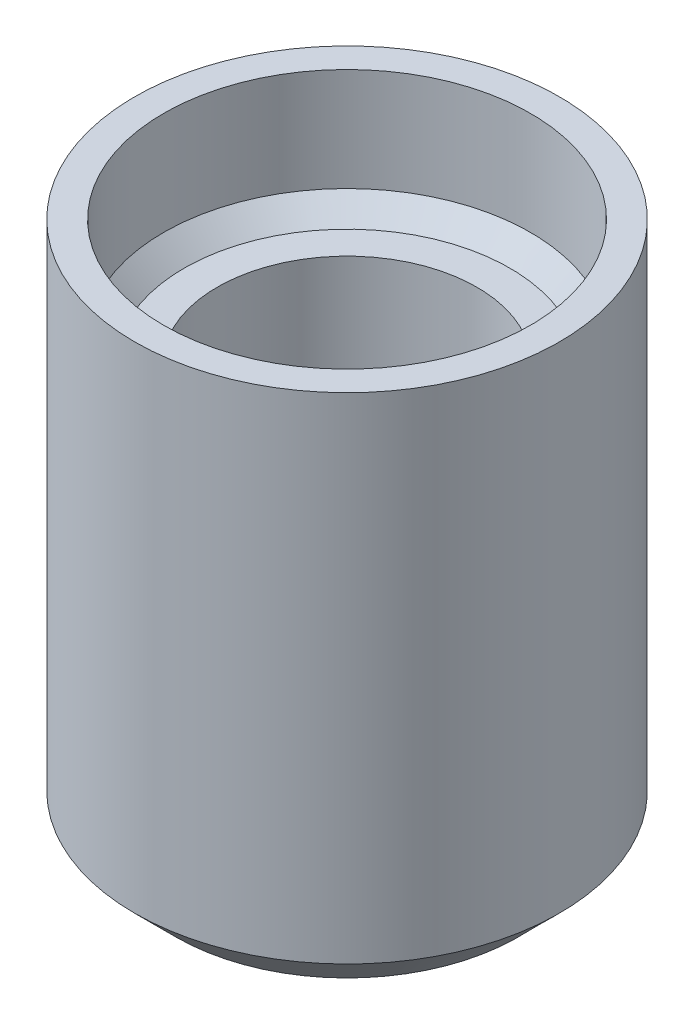
ISO-10303-21;
HEADER;
FILE_DESCRIPTION(('STEP AP214'),'2;1');
FILE_NAME('part.step','',(''),(''),'','','');
FILE_SCHEMA(('AUTOMOTIVE_DESIGN { 1 0 10303 214 1 1 1 1 }'));
ENDSEC;
DATA;
#1=APPLICATION_CONTEXT('core data for automotive mechanical design processes');
#2=APPLICATION_PROTOCOL_DEFINITION('international standard','automotive_design',2000,#1);
#3=PRODUCT_CONTEXT('',#1,'mechanical');
#4=PRODUCT('Part','Part','',(#3));
#5=PRODUCT_RELATED_PRODUCT_CATEGORY('part','',(#4));
#6=PRODUCT_DEFINITION_FORMATION('','',#4);
#7=PRODUCT_DEFINITION_CONTEXT('part definition',#1,'design');
#8=PRODUCT_DEFINITION('design','',#6,#7);
#9=PRODUCT_DEFINITION_SHAPE('','',#8);
#10=(LENGTH_UNIT() NAMED_UNIT(*) SI_UNIT(.MILLI.,.METRE.));
#11=(NAMED_UNIT(*) PLANE_ANGLE_UNIT() SI_UNIT($,.RADIAN.));
#12=(NAMED_UNIT(*) SI_UNIT($,.STERADIAN.) SOLID_ANGLE_UNIT());
#13=UNCERTAINTY_MEASURE_WITH_UNIT(LENGTH_MEASURE(1.E-05),#10,'distance_accuracy_value','');
#14=(GEOMETRIC_REPRESENTATION_CONTEXT(3) GLOBAL_UNCERTAINTY_ASSIGNED_CONTEXT((#13)) GLOBAL_UNIT_ASSIGNED_CONTEXT((#10,
#11,#12)) REPRESENTATION_CONTEXT('',''));
#15=CARTESIAN_POINT('',(0.,0.,0.));
#16=DIRECTION('',(0.,0.,1.));
#17=DIRECTION('',(1.,0.,0.));
#18=AXIS2_PLACEMENT_3D('',#15,#16,#17);
#19=CARTESIAN_POINT('',(0.,10.,0.));
#20=DIRECTION('',(0.,1.,0.));
#21=DIRECTION('',(0.,0.,1.));
#22=AXIS2_PLACEMENT_3D('',#19,#20,#21);
#23=PLANE('',#22);
#24=CARTESIAN_POINT('',(0.,10.,0.));
#25=DIRECTION('',(0.,1.,0.));
#26=DIRECTION('',(0.,0.,1.));
#27=AXIS2_PLACEMENT_3D('',#24,#25,#26);
#28=CIRCLE('',#27,3.95);
#29=CARTESIAN_POINT('',(0.,10.,3.95));
#30=VERTEX_POINT('',#29);
#31=EDGE_CURVE('E11',#30,#30,#28,.T.);
#32=ORIENTED_EDGE('',*,*,#31,.T.);
#33=EDGE_LOOP('',(#32));
#34=FACE_BOUND('',#33,.T.);
#35=CARTESIAN_POINT('',(0.,10.,0.));
#36=DIRECTION('',(0.,1.,0.));
#37=DIRECTION('',(0.,0.,1.));
#38=AXIS2_PLACEMENT_3D('',#35,#36,#37);
#39=CIRCLE('',#38,3.15);
#40=CARTESIAN_POINT('',(2.68328157299975,10.,1.65));
#41=VERTEX_POINT('',#40);
#42=CARTESIAN_POINT('',(-2.68328157299975,10.,1.65));
#43=VERTEX_POINT('',#42);
#44=EDGE_CURVE('E89',#41,#43,#39,.T.);
#45=ORIENTED_EDGE('',*,*,#44,.F.);
#46=DIRECTION('',(1.,0.,0.));
#47=VECTOR('',#46,1.);
#48=CARTESIAN_POINT('',(0.,10.,1.65));
#49=LINE('',#48,#47);
#50=EDGE_CURVE('E93',#43,#41,#49,.T.);
#51=ORIENTED_EDGE('',*,*,#50,.F.);
#52=EDGE_LOOP('',(#45,#51));
#53=FACE_BOUND('',#52,.T.);
#54=ADVANCED_FACE('F49',(#34,#53),#23,.T.);
#55=CARTESIAN_POINT('',(0.,10.,0.));
#56=DIRECTION('',(0.,-1.,0.));
#57=DIRECTION('',(0.,0.,-1.));
#58=AXIS2_PLACEMENT_3D('',#55,#56,#57);
#59=CYLINDRICAL_SURFACE('',#58,3.15);
#60=DIRECTION('',(0.,-1.,0.));
#61=VECTOR('',#60,1.);
#62=CARTESIAN_POINT('',(-2.68328157299975,10.,1.65));
#63=LINE('',#62,#61);
#64=CARTESIAN_POINT('',(-2.68328157299975,2.,1.65));
#65=VERTEX_POINT('',#64);
#66=EDGE_CURVE('E72',#43,#65,#63,.T.);
#67=ORIENTED_EDGE('',*,*,#66,.T.);
#68=CARTESIAN_POINT('',(0.,2.,0.));
#69=DIRECTION('',(0.,-1.,0.));
#70=DIRECTION('',(0.,0.,-1.));
#71=AXIS2_PLACEMENT_3D('',#68,#69,#70);
#72=CIRCLE('',#71,3.15);
#73=CARTESIAN_POINT('',(2.68328157299975,2.,1.65));
#74=VERTEX_POINT('',#73);
#75=EDGE_CURVE('E65',#65,#74,#72,.T.);
#76=ORIENTED_EDGE('',*,*,#75,.T.);
#77=DIRECTION('',(0.,-1.,0.));
#78=VECTOR('',#77,1.);
#79=CARTESIAN_POINT('',(2.68328157299975,10.,1.65));
#80=LINE('',#79,#78);
#81=EDGE_CURVE('E86',#41,#74,#80,.T.);
#82=ORIENTED_EDGE('',*,*,#81,.F.);
#83=ORIENTED_EDGE('',*,*,#44,.T.);
#84=EDGE_LOOP('',(#67,#76,#82,#83));
#85=FACE_BOUND('',#84,.T.);
#86=ADVANCED_FACE('F85',(#85),#59,.F.);
#87=CARTESIAN_POINT('',(0.,10.,1.65));
#88=DIRECTION('',(0.,0.,-1.));
#89=DIRECTION('',(-1.,0.,0.));
#90=AXIS2_PLACEMENT_3D('',#87,#88,#89);
#91=PLANE('',#90);
#92=ORIENTED_EDGE('',*,*,#81,.T.);
#93=DIRECTION('',(-1.,0.,0.));
#94=VECTOR('',#93,1.);
#95=CARTESIAN_POINT('',(0.,2.,1.65));
#96=LINE('',#95,#94);
#97=EDGE_CURVE('E78',#74,#65,#96,.T.);
#98=ORIENTED_EDGE('',*,*,#97,.T.);
#99=ORIENTED_EDGE('',*,*,#66,.F.);
#100=ORIENTED_EDGE('',*,*,#50,.T.);
#101=EDGE_LOOP('',(#92,#98,#99,#100));
#102=FACE_BOUND('',#101,.T.);
#103=ADVANCED_FACE('F91',(#102),#91,.T.);
#104=CARTESIAN_POINT('',(0.,2.,0.));
#105=DIRECTION('',(0.,-1.,0.));
#106=DIRECTION('',(0.,0.,-1.));
#107=AXIS2_PLACEMENT_3D('',#104,#105,#106);
#108=PLANE('',#107);
#109=ORIENTED_EDGE('',*,*,#75,.F.);
#110=ORIENTED_EDGE('',*,*,#97,.F.);
#111=EDGE_LOOP('',(#109,#110));
#112=FACE_BOUND('',#111,.T.);
#113=ADVANCED_FACE('F79',(#112),#108,.F.);
#114=CARTESIAN_POINT('',(0.,13.,0.));
#115=DIRECTION('',(0.,1.,0.));
#116=DIRECTION('',(0.,0.,1.));
#117=AXIS2_PLACEMENT_3D('',#114,#115,#116);
#118=PLANE('',#117);
#119=CARTESIAN_POINT('',(0.,13.,0.));
#120=DIRECTION('',(0.,1.,0.));
#121=DIRECTION('',(0.,0.,1.));
#122=AXIS2_PLACEMENT_3D('',#119,#120,#121);
#123=CIRCLE('',#122,5.15);
#124=CARTESIAN_POINT('',(0.,13.,5.15));
#125=VERTEX_POINT('',#124);
#126=EDGE_CURVE('E82',#125,#125,#123,.T.);
#127=ORIENTED_EDGE('',*,*,#126,.T.);
#128=EDGE_LOOP('',(#127));
#129=FACE_BOUND('',#128,.T.);
#130=CARTESIAN_POINT('',(0.,13.,0.));
#131=DIRECTION('',(0.,1.,0.));
#132=DIRECTION('',(0.,0.,1.));
#133=AXIS2_PLACEMENT_3D('',#130,#131,#132);
#134=CIRCLE('',#133,4.45);
#135=CARTESIAN_POINT('',(0.,13.,4.45));
#136=VERTEX_POINT('',#135);
#137=EDGE_CURVE('E164',#136,#136,#134,.T.);
#138=ORIENTED_EDGE('',*,*,#137,.F.);
#139=EDGE_LOOP('',(#138));
#140=FACE_BOUND('',#139,.T.);
#141=ADVANCED_FACE('F151',(#129,#140),#118,.T.);
#142=CARTESIAN_POINT('',(0.,13.,0.));
#143=DIRECTION('',(0.,-1.,0.));
#144=DIRECTION('',(0.,0.,-1.));
#145=AXIS2_PLACEMENT_3D('',#142,#143,#144);
#146=CYLINDRICAL_SURFACE('',#145,4.45);
#147=CARTESIAN_POINT('',(0.,10.5,0.));
#148=DIRECTION('',(0.,1.,0.));
#149=DIRECTION('',(0.,0.,1.));
#150=AXIS2_PLACEMENT_3D('',#147,#148,#149);
#151=CIRCLE('',#150,4.45);
#152=CARTESIAN_POINT('',(0.,10.5,4.45));
#153=VERTEX_POINT('',#152);
#154=EDGE_CURVE('E59',#153,#153,#151,.F.);
#155=ORIENTED_EDGE('',*,*,#154,.T.);
#156=EDGE_LOOP('',(#155));
#157=FACE_BOUND('',#156,.T.);
#158=ORIENTED_EDGE('',*,*,#137,.T.);
#159=EDGE_LOOP('',(#158));
#160=FACE_BOUND('',#159,.T.);
#161=ADVANCED_FACE('F111',(#157,#160),#146,.F.);
#162=CARTESIAN_POINT('',(0.,0.,0.));
#163=DIRECTION('',(0.,1.,0.));
#164=DIRECTION('',(0.,0.,1.));
#165=AXIS2_PLACEMENT_3D('',#162,#163,#164);
#166=PLANE('',#165);
#167=CARTESIAN_POINT('',(0.,0.,0.));
#168=DIRECTION('',(0.,1.,0.));
#169=DIRECTION('',(0.,0.,1.));
#170=AXIS2_PLACEMENT_3D('',#167,#168,#169);
#171=CIRCLE('',#170,4.15);
#172=CARTESIAN_POINT('',(0.,0.,4.15));
#173=VERTEX_POINT('',#172);
#174=EDGE_CURVE('E100',#173,#173,#171,.F.);
#175=ORIENTED_EDGE('',*,*,#174,.T.);
#176=EDGE_LOOP('',(#175));
#177=FACE_BOUND('',#176,.T.);
#178=ADVANCED_FACE('F135',(#177),#166,.F.);
#179=CARTESIAN_POINT('',(0.,10.,0.));
#180=DIRECTION('',(0.,-1.,0.));
#181=DIRECTION('',(0.,0.,-1.));
#182=AXIS2_PLACEMENT_3D('',#179,#180,#181);
#183=CYLINDRICAL_SURFACE('',#182,5.15);
#184=CARTESIAN_POINT('',(0.,0.999999999999997,0.));
#185=DIRECTION('',(0.,1.,0.));
#186=DIRECTION('',(0.,0.,1.));
#187=AXIS2_PLACEMENT_3D('',#184,#185,#186);
#188=CIRCLE('',#187,5.15);
#189=CARTESIAN_POINT('',(0.,0.999999999999997,5.15));
#190=VERTEX_POINT('',#189);
#191=EDGE_CURVE('E95',#190,#190,#188,.T.);
#192=ORIENTED_EDGE('',*,*,#191,.T.);
#193=EDGE_LOOP('',(#192));
#194=FACE_BOUND('',#193,.T.);
#195=ORIENTED_EDGE('',*,*,#126,.F.);
#196=EDGE_LOOP('',(#195));
#197=FACE_BOUND('',#196,.T.);
#198=ADVANCED_FACE('F121',(#194,#197),#183,.T.);
#199=CARTESIAN_POINT('',(0.,0.999999999999997,0.));
#200=DIRECTION('',(0.,1.,0.));
#201=DIRECTION('',(0.,0.,1.));
#202=AXIS2_PLACEMENT_3D('',#199,#200,#201);
#203=CONICAL_SURFACE('',#202,5.15,0.78539816339745);
#204=ORIENTED_EDGE('',*,*,#174,.F.);
#205=EDGE_LOOP('',(#204));
#206=FACE_BOUND('',#205,.T.);
#207=ORIENTED_EDGE('',*,*,#191,.F.);
#208=EDGE_LOOP('',(#207));
#209=FACE_BOUND('',#208,.T.);
#210=ADVANCED_FACE('F115',(#206,#209),#203,.T.);
#211=CARTESIAN_POINT('',(0.,10.5,0.));
#212=DIRECTION('',(0.,1.,0.));
#213=DIRECTION('',(0.,0.,1.));
#214=AXIS2_PLACEMENT_3D('',#211,#212,#213);
#215=CONICAL_SURFACE('',#214,4.45,0.785398163397443);
#216=ORIENTED_EDGE('',*,*,#31,.F.);
#217=EDGE_LOOP('',(#216));
#218=FACE_BOUND('',#217,.T.);
#219=ORIENTED_EDGE('',*,*,#154,.F.);
#220=EDGE_LOOP('',(#219));
#221=FACE_BOUND('',#220,.T.);
#222=ADVANCED_FACE('F52',(#218,#221),#215,.F.);
#223=CLOSED_SHELL('',(#54,#86,#103,#113,#141,#161,#178,#198,#210,#222));
#224=MANIFOLD_SOLID_BREP('B2',#223);
#225=ADVANCED_BREP_SHAPE_REPRESENTATION('',(#18,#224),#14);
#226=SHAPE_DEFINITION_REPRESENTATION(#9,#225);
ENDSEC;
END-ISO-10303-21;
